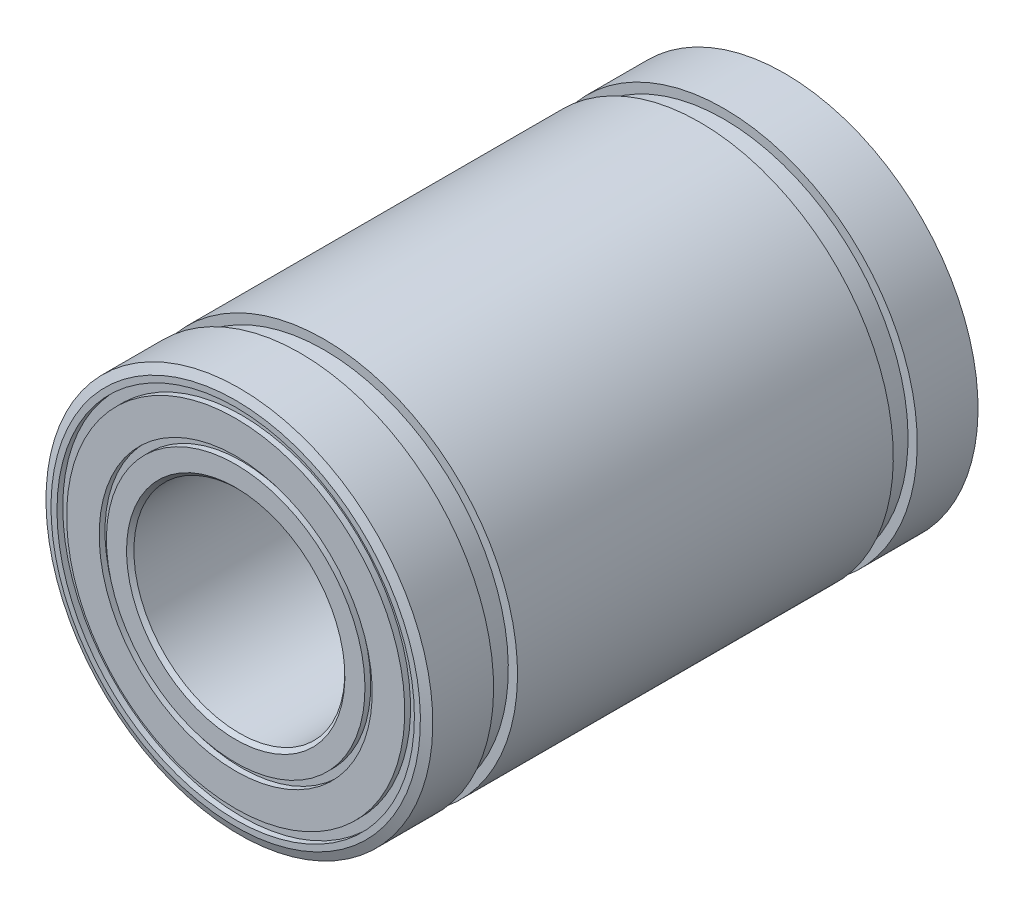
ISO-10303-21;
HEADER;
FILE_DESCRIPTION(('STEP AP214'),'2;1');
FILE_NAME('part.step','',(''),(''),'','','');
FILE_SCHEMA(('AUTOMOTIVE_DESIGN { 1 0 10303 214 1 1 1 1 }'));
ENDSEC;
DATA;
#1=APPLICATION_CONTEXT('core data for automotive mechanical design processes');
#2=APPLICATION_PROTOCOL_DEFINITION('international standard','automotive_design',2000,#1);
#3=PRODUCT_CONTEXT('',#1,'mechanical');
#4=PRODUCT('Part','Part','',(#3));
#5=PRODUCT_RELATED_PRODUCT_CATEGORY('part','',(#4));
#6=PRODUCT_DEFINITION_FORMATION('','',#4);
#7=PRODUCT_DEFINITION_CONTEXT('part definition',#1,'design');
#8=PRODUCT_DEFINITION('design','',#6,#7);
#9=PRODUCT_DEFINITION_SHAPE('','',#8);
#10=(LENGTH_UNIT() NAMED_UNIT(*) SI_UNIT(.MILLI.,.METRE.));
#11=(NAMED_UNIT(*) PLANE_ANGLE_UNIT() SI_UNIT($,.RADIAN.));
#12=(NAMED_UNIT(*) SI_UNIT($,.STERADIAN.) SOLID_ANGLE_UNIT());
#13=UNCERTAINTY_MEASURE_WITH_UNIT(LENGTH_MEASURE(1.E-05),#10,'distance_accuracy_value','');
#14=(GEOMETRIC_REPRESENTATION_CONTEXT(3) GLOBAL_UNCERTAINTY_ASSIGNED_CONTEXT((#13)) GLOBAL_UNIT_ASSIGNED_CONTEXT((#10,
#11,#12)) REPRESENTATION_CONTEXT('',''));
#15=CARTESIAN_POINT('',(0.,0.,0.));
#16=DIRECTION('',(0.,0.,1.));
#17=DIRECTION('',(1.,0.,0.));
#18=AXIS2_PLACEMENT_3D('',#15,#16,#17);
#19=CARTESIAN_POINT('',(7.63714285715196,0.,15.7142857142884));
#20=DIRECTION('',(0.,0.,1.));
#21=DIRECTION('',(0.,-1.,0.));
#22=AXIS2_PLACEMENT_3D('',#19,#20,#21);
#23=PLANE('',#22);
#24=CARTESIAN_POINT('',(0.285714285727279,0.,15.7142857142884));
#25=DIRECTION('',(0.,0.,-1.));
#26=DIRECTION('',(0.,1.,0.));
#27=AXIS2_PLACEMENT_3D('',#24,#25,#26);
#28=CIRCLE('',#27,6.20952380958975);
#29=CARTESIAN_POINT('',(0.285714285727279,6.20952380958975,15.7142857142884));
#30=VERTEX_POINT('',#29);
#31=EDGE_CURVE('E131',#30,#30,#28,.T.);
#32=ORIENTED_EDGE('',*,*,#31,.T.);
#33=EDGE_LOOP('',(#32));
#34=FACE_BOUND('',#33,.T.);
#35=CARTESIAN_POINT('',(0.285714285727279,0.,15.7142857142884));
#36=DIRECTION('',(0.,0.,-1.));
#37=DIRECTION('',(0.,1.,0.));
#38=AXIS2_PLACEMENT_3D('',#35,#36,#37);
#39=CIRCLE('',#38,7.35142857142468);
#40=CARTESIAN_POINT('',(0.285714285727279,7.35142857142468,15.7142857142884));
#41=VERTEX_POINT('',#40);
#42=EDGE_CURVE('E10',#41,#41,#39,.T.);
#43=ORIENTED_EDGE('',*,*,#42,.F.);
#44=EDGE_LOOP('',(#43));
#45=FACE_BOUND('',#44,.T.);
#46=ADVANCED_FACE('F31',(#34,#45),#23,.T.);
#47=CARTESIAN_POINT('',(0.285714285727279,0.,15.7142857142884));
#48=DIRECTION('',(0.,0.,-1.));
#49=DIRECTION('',(0.,1.,0.));
#50=AXIS2_PLACEMENT_3D('',#47,#48,#49);
#51=CYLINDRICAL_SURFACE('',#50,7.35142857142468);
#52=ORIENTED_EDGE('',*,*,#42,.T.);
#53=EDGE_LOOP('',(#52));
#54=FACE_BOUND('',#53,.T.);
#55=CARTESIAN_POINT('',(0.285714285727279,0.,15.3842857142286));
#56=DIRECTION('',(0.,0.,-1.));
#57=DIRECTION('',(0.,1.,0.));
#58=AXIS2_PLACEMENT_3D('',#55,#56,#57);
#59=CIRCLE('',#58,7.35142857142468);
#60=CARTESIAN_POINT('',(0.285714285727279,7.35142857142468,15.3842857142286));
#61=VERTEX_POINT('',#60);
#62=EDGE_CURVE('E37',#61,#61,#59,.T.);
#63=ORIENTED_EDGE('',*,*,#62,.F.);
#64=EDGE_LOOP('',(#63));
#65=FACE_BOUND('',#64,.T.);
#66=ADVANCED_FACE('F149',(#54,#65),#51,.T.);
#67=CARTESIAN_POINT('',(8.04964285715084,0.,15.3842857142286));
#68=DIRECTION('',(0.,0.,1.));
#69=DIRECTION('',(0.,-1.,0.));
#70=AXIS2_PLACEMENT_3D('',#67,#68,#69);
#71=PLANE('',#70);
#72=ORIENTED_EDGE('',*,*,#62,.T.);
#73=EDGE_LOOP('',(#72));
#74=FACE_BOUND('',#73,.T.);
#75=CARTESIAN_POINT('',(0.285714285727279,0.,15.3842857142286));
#76=DIRECTION('',(0.,0.,-1.));
#77=DIRECTION('',(0.,1.,0.));
#78=AXIS2_PLACEMENT_3D('',#75,#76,#77);
#79=CIRCLE('',#78,7.76392857142356);
#80=CARTESIAN_POINT('',(0.285714285727279,7.76392857142355,15.3842857142286));
#81=VERTEX_POINT('',#80);
#82=EDGE_CURVE('E41',#81,#81,#79,.T.);
#83=ORIENTED_EDGE('',*,*,#82,.F.);
#84=EDGE_LOOP('',(#83));
#85=FACE_BOUND('',#84,.T.);
#86=ADVANCED_FACE('F153',(#74,#85),#71,.T.);
#87=CARTESIAN_POINT('',(0.285714285727279,0.,15.7142857142884));
#88=DIRECTION('',(0.,0.,-1.));
#89=DIRECTION('',(0.,1.,0.));
#90=AXIS2_PLACEMENT_3D('',#87,#88,#89);
#91=CYLINDRICAL_SURFACE('',#90,7.76392857142356);
#92=ORIENTED_EDGE('',*,*,#82,.T.);
#93=EDGE_LOOP('',(#92));
#94=FACE_BOUND('',#93,.T.);
#95=CARTESIAN_POINT('',(0.285714285727279,0.,15.7142857142884));
#96=DIRECTION('',(0.,0.,-1.));
#97=DIRECTION('',(0.,1.,0.));
#98=AXIS2_PLACEMENT_3D('',#95,#96,#97);
#99=CIRCLE('',#98,7.76392857142356);
#100=CARTESIAN_POINT('',(0.285714285727279,7.76392857142355,15.7142857142884));
#101=VERTEX_POINT('',#100);
#102=EDGE_CURVE('E45',#101,#101,#99,.T.);
#103=ORIENTED_EDGE('',*,*,#102,.F.);
#104=EDGE_LOOP('',(#103));
#105=FACE_BOUND('',#104,.T.);
#106=ADVANCED_FACE('F157',(#94,#105),#91,.F.);
#107=CARTESIAN_POINT('',(9.90000000000297,0.,15.7142857142884));
#108=DIRECTION('',(0.,0.,1.));
#109=DIRECTION('',(0.,-1.,0.));
#110=AXIS2_PLACEMENT_3D('',#107,#108,#109);
#111=PLANE('',#110);
#112=ORIENTED_EDGE('',*,*,#102,.T.);
#113=EDGE_LOOP('',(#112));
#114=FACE_BOUND('',#113,.T.);
#115=CARTESIAN_POINT('',(0.285714285727279,0.,15.7142857142884));
#116=DIRECTION('',(0.,0.,-1.));
#117=DIRECTION('',(0.,1.,0.));
#118=AXIS2_PLACEMENT_3D('',#115,#116,#117);
#119=CIRCLE('',#118,9.6142857142757);
#120=CARTESIAN_POINT('',(0.285714285727279,9.61428571427569,15.7142857142884));
#121=VERTEX_POINT('',#120);
#122=EDGE_CURVE('E50',#121,#121,#119,.T.);
#123=ORIENTED_EDGE('',*,*,#122,.F.);
#124=EDGE_LOOP('',(#123));
#125=FACE_BOUND('',#124,.T.);
#126=ADVANCED_FACE('F163',(#114,#125),#111,.T.);
#127=CARTESIAN_POINT('',(0.285714285727279,0.,15.7142857142884));
#128=DIRECTION('',(0.,0.,-1.));
#129=DIRECTION('',(0.,1.,0.));
#130=AXIS2_PLACEMENT_3D('',#127,#128,#129);
#131=CYLINDRICAL_SURFACE('',#130,9.6142857142757);
#132=ORIENTED_EDGE('',*,*,#122,.T.);
#133=EDGE_LOOP('',(#132));
#134=FACE_BOUND('',#133,.T.);
#135=CARTESIAN_POINT('',(0.285714285727279,0.,15.3842857142286));
#136=DIRECTION('',(0.,0.,-1.));
#137=DIRECTION('',(0.,1.,0.));
#138=AXIS2_PLACEMENT_3D('',#135,#136,#137);
#139=CIRCLE('',#138,9.6142857142757);
#140=CARTESIAN_POINT('',(0.285714285727279,9.61428571427569,15.3842857142286));
#141=VERTEX_POINT('',#140);
#142=EDGE_CURVE('E53',#141,#141,#139,.T.);
#143=ORIENTED_EDGE('',*,*,#142,.F.);
#144=EDGE_LOOP('',(#143));
#145=FACE_BOUND('',#144,.T.);
#146=ADVANCED_FACE('F167',(#134,#145),#131,.T.);
#147=CARTESIAN_POINT('',(10.4500000000015,0.,15.3842857142286));
#148=DIRECTION('',(0.,0.,1.));
#149=DIRECTION('',(0.,-1.,0.));
#150=AXIS2_PLACEMENT_3D('',#147,#148,#149);
#151=PLANE('',#150);
#152=ORIENTED_EDGE('',*,*,#142,.T.);
#153=EDGE_LOOP('',(#152));
#154=FACE_BOUND('',#153,.T.);
#155=CARTESIAN_POINT('',(0.285714285727279,0.,15.3842857142286));
#156=DIRECTION('',(0.,0.,-1.));
#157=DIRECTION('',(0.,1.,0.));
#158=AXIS2_PLACEMENT_3D('',#155,#156,#157);
#159=CIRCLE('',#158,10.1642857142742);
#160=CARTESIAN_POINT('',(0.285714285727279,10.1642857142742,15.3842857142286));
#161=VERTEX_POINT('',#160);
#162=EDGE_CURVE('E56',#161,#161,#159,.T.);
#163=ORIENTED_EDGE('',*,*,#162,.F.);
#164=EDGE_LOOP('',(#163));
#165=FACE_BOUND('',#164,.T.);
#166=ADVANCED_FACE('F171',(#154,#165),#151,.T.);
#167=CARTESIAN_POINT('',(0.285714285727279,0.,15.7142857142884));
#168=DIRECTION('',(0.,0.,-1.));
#169=DIRECTION('',(0.,1.,0.));
#170=AXIS2_PLACEMENT_3D('',#167,#168,#169);
#171=CYLINDRICAL_SURFACE('',#170,10.1642857142742);
#172=ORIENTED_EDGE('',*,*,#162,.T.);
#173=EDGE_LOOP('',(#172));
#174=FACE_BOUND('',#173,.T.);
#175=CARTESIAN_POINT('',(0.285714285727279,0.,15.7142857142884));
#176=DIRECTION('',(0.,0.,-1.));
#177=DIRECTION('',(0.,1.,0.));
#178=AXIS2_PLACEMENT_3D('',#175,#176,#177);
#179=CIRCLE('',#178,10.1642857142742);
#180=CARTESIAN_POINT('',(0.285714285727279,10.1642857142742,15.7142857142884));
#181=VERTEX_POINT('',#180);
#182=EDGE_CURVE('E59',#181,#181,#179,.T.);
#183=ORIENTED_EDGE('',*,*,#182,.F.);
#184=EDGE_LOOP('',(#183));
#185=FACE_BOUND('',#184,.T.);
#186=ADVANCED_FACE('F175',(#174,#185),#171,.F.);
#187=CARTESIAN_POINT('',(10.790476190447,0.,15.7142857142884));
#188=DIRECTION('',(0.,0.,1.));
#189=DIRECTION('',(0.,-1.,0.));
#190=AXIS2_PLACEMENT_3D('',#187,#188,#189);
#191=PLANE('',#190);
#192=ORIENTED_EDGE('',*,*,#182,.T.);
#193=EDGE_LOOP('',(#192));
#194=FACE_BOUND('',#193,.T.);
#195=CARTESIAN_POINT('',(0.285714285727279,0.,15.7142857142884));
#196=DIRECTION('',(0.,0.,-1.));
#197=DIRECTION('',(0.,1.,0.));
#198=AXIS2_PLACEMENT_3D('',#195,#196,#197);
#199=CIRCLE('',#198,10.5047619047197);
#200=CARTESIAN_POINT('',(0.285714285727279,10.5047619047197,15.7142857142884));
#201=VERTEX_POINT('',#200);
#202=EDGE_CURVE('E62',#201,#201,#199,.T.);
#203=ORIENTED_EDGE('',*,*,#202,.F.);
#204=EDGE_LOOP('',(#203));
#205=FACE_BOUND('',#204,.T.);
#206=ADVANCED_FACE('F179',(#194,#205),#191,.T.);
#207=CARTESIAN_POINT('',(0.285714285727279,0.,15.5047619047045));
#208=DIRECTION('',(0.,0.,-1.));
#209=DIRECTION('',(0.,1.,0.));
#210=AXIS2_PLACEMENT_3D('',#207,#208,#209);
#211=CONICAL_SURFACE('',#210,11.,1.17055566968845);
#212=ORIENTED_EDGE('',*,*,#202,.T.);
#213=EDGE_LOOP('',(#212));
#214=FACE_BOUND('',#213,.T.);
#215=CARTESIAN_POINT('',(0.285714285727279,0.,15.5047619047045));
#216=DIRECTION('',(0.,0.,-1.));
#217=DIRECTION('',(0.,1.,0.));
#218=AXIS2_PLACEMENT_3D('',#215,#216,#217);
#219=CIRCLE('',#218,11.);
#220=CARTESIAN_POINT('',(0.285714285727279,11.,15.5047619047045));
#221=VERTEX_POINT('',#220);
#222=EDGE_CURVE('E65',#221,#221,#219,.T.);
#223=ORIENTED_EDGE('',*,*,#222,.F.);
#224=EDGE_LOOP('',(#223));
#225=FACE_BOUND('',#224,.T.);
#226=ADVANCED_FACE('F183',(#214,#225),#211,.T.);
#227=CARTESIAN_POINT('',(0.285714285727279,0.,15.7142857142884));
#228=DIRECTION('',(0.,0.,-1.));
#229=DIRECTION('',(0.,1.,0.));
#230=AXIS2_PLACEMENT_3D('',#227,#228,#229);
#231=CYLINDRICAL_SURFACE('',#230,11.);
#232=ORIENTED_EDGE('',*,*,#222,.T.);
#233=EDGE_LOOP('',(#232));
#234=FACE_BOUND('',#233,.T.);
#235=CARTESIAN_POINT('',(0.285714285727279,0.,12.047619047571));
#236=DIRECTION('',(0.,0.,-1.));
#237=DIRECTION('',(0.,1.,0.));
#238=AXIS2_PLACEMENT_3D('',#235,#236,#237);
#239=CIRCLE('',#238,11.);
#240=CARTESIAN_POINT('',(0.285714285727279,11.,12.047619047571));
#241=VERTEX_POINT('',#240);
#242=EDGE_CURVE('E68',#241,#241,#239,.T.);
#243=ORIENTED_EDGE('',*,*,#242,.F.);
#244=EDGE_LOOP('',(#243));
#245=FACE_BOUND('',#244,.T.);
#246=ADVANCED_FACE('F187',(#234,#245),#231,.T.);
#247=CARTESIAN_POINT('',(10.7619047619192,0.,12.047619047571));
#248=DIRECTION('',(0.,0.,-1.));
#249=DIRECTION('',(0.,1.,0.));
#250=AXIS2_PLACEMENT_3D('',#247,#248,#249);
#251=PLANE('',#250);
#252=ORIENTED_EDGE('',*,*,#242,.T.);
#253=EDGE_LOOP('',(#252));
#254=FACE_BOUND('',#253,.T.);
#255=CARTESIAN_POINT('',(0.285714285727279,0.,12.047619047571));
#256=DIRECTION('',(0.,0.,-1.));
#257=DIRECTION('',(0.,1.,0.));
#258=AXIS2_PLACEMENT_3D('',#255,#256,#257);
#259=CIRCLE('',#258,10.4761904761919);
#260=CARTESIAN_POINT('',(0.285714285727279,10.4761904761919,12.047619047571));
#261=VERTEX_POINT('',#260);
#262=EDGE_CURVE('E71',#261,#261,#259,.T.);
#263=ORIENTED_EDGE('',*,*,#262,.F.);
#264=EDGE_LOOP('',(#263));
#265=FACE_BOUND('',#264,.T.);
#266=ADVANCED_FACE('F191',(#254,#265),#251,.T.);
#267=CARTESIAN_POINT('',(0.285714285727279,0.,15.7142857142884));
#268=DIRECTION('',(0.,0.,-1.));
#269=DIRECTION('',(0.,1.,0.));
#270=AXIS2_PLACEMENT_3D('',#267,#268,#269);
#271=CYLINDRICAL_SURFACE('',#270,10.4761904761919);
#272=ORIENTED_EDGE('',*,*,#262,.T.);
#273=EDGE_LOOP('',(#272));
#274=FACE_BOUND('',#273,.T.);
#275=CARTESIAN_POINT('',(0.28571428572728,0.,10.6857142856699));
#276=DIRECTION('',(0.,0.,-1.));
#277=DIRECTION('',(0.,1.,0.));
#278=AXIS2_PLACEMENT_3D('',#275,#276,#277);
#279=CIRCLE('',#278,10.4761904761919);
#280=CARTESIAN_POINT('',(0.28571428572728,10.4761904761919,10.6857142856699));
#281=VERTEX_POINT('',#280);
#282=EDGE_CURVE('E74',#281,#281,#279,.T.);
#283=ORIENTED_EDGE('',*,*,#282,.F.);
#284=EDGE_LOOP('',(#283));
#285=FACE_BOUND('',#284,.T.);
#286=ADVANCED_FACE('F195',(#274,#285),#271,.T.);
#287=CARTESIAN_POINT('',(11.2857142857273,0.,10.6857142856699));
#288=DIRECTION('',(0.,0.,1.));
#289=DIRECTION('',(0.,-1.,0.));
#290=AXIS2_PLACEMENT_3D('',#287,#288,#289);
#291=PLANE('',#290);
#292=ORIENTED_EDGE('',*,*,#282,.T.);
#293=EDGE_LOOP('',(#292));
#294=FACE_BOUND('',#293,.T.);
#295=CARTESIAN_POINT('',(0.28571428572728,0.,10.6857142856699));
#296=DIRECTION('',(0.,0.,-1.));
#297=DIRECTION('',(0.,1.,0.));
#298=AXIS2_PLACEMENT_3D('',#295,#296,#297);
#299=CIRCLE('',#298,11.);
#300=CARTESIAN_POINT('',(0.28571428572728,11.,10.6857142856699));
#301=VERTEX_POINT('',#300);
#302=EDGE_CURVE('E77',#301,#301,#299,.T.);
#303=ORIENTED_EDGE('',*,*,#302,.F.);
#304=EDGE_LOOP('',(#303));
#305=FACE_BOUND('',#304,.T.);
#306=ADVANCED_FACE('F199',(#294,#305),#291,.T.);
#307=CARTESIAN_POINT('',(0.285714285727279,0.,15.7142857142884));
#308=DIRECTION('',(0.,0.,-1.));
#309=DIRECTION('',(0.,1.,0.));
#310=AXIS2_PLACEMENT_3D('',#307,#308,#309);
#311=CYLINDRICAL_SURFACE('',#310,11.);
#312=ORIENTED_EDGE('',*,*,#302,.T.);
#313=EDGE_LOOP('',(#312));
#314=FACE_BOUND('',#313,.T.);
#315=CARTESIAN_POINT('',(0.285714285727282,0.,-10.6857142857008));
#316=DIRECTION('',(0.,0.,-1.));
#317=DIRECTION('',(0.,1.,0.));
#318=AXIS2_PLACEMENT_3D('',#315,#316,#317);
#319=CIRCLE('',#318,11.);
#320=CARTESIAN_POINT('',(0.285714285727282,11.,-10.6857142857008));
#321=VERTEX_POINT('',#320);
#322=EDGE_CURVE('E80',#321,#321,#319,.T.);
#323=ORIENTED_EDGE('',*,*,#322,.F.);
#324=EDGE_LOOP('',(#323));
#325=FACE_BOUND('',#324,.T.);
#326=ADVANCED_FACE('F203',(#314,#325),#311,.T.);
#327=CARTESIAN_POINT('',(10.7619047619192,0.,-10.6857142857008));
#328=DIRECTION('',(0.,0.,-1.));
#329=DIRECTION('',(0.,1.,0.));
#330=AXIS2_PLACEMENT_3D('',#327,#328,#329);
#331=PLANE('',#330);
#332=ORIENTED_EDGE('',*,*,#322,.T.);
#333=EDGE_LOOP('',(#332));
#334=FACE_BOUND('',#333,.T.);
#335=CARTESIAN_POINT('',(0.285714285727282,0.,-10.6857142857008));
#336=DIRECTION('',(0.,0.,-1.));
#337=DIRECTION('',(0.,1.,0.));
#338=AXIS2_PLACEMENT_3D('',#335,#336,#337);
#339=CIRCLE('',#338,10.4761904761919);
#340=CARTESIAN_POINT('',(0.285714285727282,10.4761904761919,-10.6857142857008));
#341=VERTEX_POINT('',#340);
#342=EDGE_CURVE('E83',#341,#341,#339,.T.);
#343=ORIENTED_EDGE('',*,*,#342,.F.);
#344=EDGE_LOOP('',(#343));
#345=FACE_BOUND('',#344,.T.);
#346=ADVANCED_FACE('F207',(#334,#345),#331,.T.);
#347=CARTESIAN_POINT('',(0.285714285727279,0.,15.7142857142884));
#348=DIRECTION('',(0.,0.,-1.));
#349=DIRECTION('',(0.,1.,0.));
#350=AXIS2_PLACEMENT_3D('',#347,#348,#349);
#351=CYLINDRICAL_SURFACE('',#350,10.4761904761919);
#352=ORIENTED_EDGE('',*,*,#342,.T.);
#353=EDGE_LOOP('',(#352));
#354=FACE_BOUND('',#353,.T.);
#355=CARTESIAN_POINT('',(0.285714285727282,0.,-12.0476190476019));
#356=DIRECTION('',(0.,0.,-1.));
#357=DIRECTION('',(0.,1.,0.));
#358=AXIS2_PLACEMENT_3D('',#355,#356,#357);
#359=CIRCLE('',#358,10.4761904761919);
#360=CARTESIAN_POINT('',(0.285714285727282,10.4761904761919,-12.0476190476019));
#361=VERTEX_POINT('',#360);
#362=EDGE_CURVE('E86',#361,#361,#359,.T.);
#363=ORIENTED_EDGE('',*,*,#362,.F.);
#364=EDGE_LOOP('',(#363));
#365=FACE_BOUND('',#364,.T.);
#366=ADVANCED_FACE('F211',(#354,#365),#351,.T.);
#367=CARTESIAN_POINT('',(11.2857142857273,0.,-12.0476190476019));
#368=DIRECTION('',(0.,0.,1.));
#369=DIRECTION('',(0.,-1.,0.));
#370=AXIS2_PLACEMENT_3D('',#367,#368,#369);
#371=PLANE('',#370);
#372=ORIENTED_EDGE('',*,*,#362,.T.);
#373=EDGE_LOOP('',(#372));
#374=FACE_BOUND('',#373,.T.);
#375=CARTESIAN_POINT('',(0.285714285727282,0.,-12.0476190476019));
#376=DIRECTION('',(0.,0.,-1.));
#377=DIRECTION('',(0.,1.,0.));
#378=AXIS2_PLACEMENT_3D('',#375,#376,#377);
#379=CIRCLE('',#378,11.);
#380=CARTESIAN_POINT('',(0.285714285727282,11.,-12.0476190476019));
#381=VERTEX_POINT('',#380);
#382=EDGE_CURVE('E89',#381,#381,#379,.T.);
#383=ORIENTED_EDGE('',*,*,#382,.F.);
#384=EDGE_LOOP('',(#383));
#385=FACE_BOUND('',#384,.T.);
#386=ADVANCED_FACE('F215',(#374,#385),#371,.T.);
#387=CARTESIAN_POINT('',(0.285714285727279,0.,15.7142857142884));
#388=DIRECTION('',(0.,0.,-1.));
#389=DIRECTION('',(0.,1.,0.));
#390=AXIS2_PLACEMENT_3D('',#387,#388,#389);
#391=CYLINDRICAL_SURFACE('',#390,11.);
#392=ORIENTED_EDGE('',*,*,#382,.T.);
#393=EDGE_LOOP('',(#392));
#394=FACE_BOUND('',#393,.T.);
#395=CARTESIAN_POINT('',(0.285714285727283,0.,-15.5047619047354));
#396=DIRECTION('',(0.,0.,-1.));
#397=DIRECTION('',(0.,1.,0.));
#398=AXIS2_PLACEMENT_3D('',#395,#396,#397);
#399=CIRCLE('',#398,11.);
#400=CARTESIAN_POINT('',(0.285714285727283,11.,-15.5047619047354));
#401=VERTEX_POINT('',#400);
#402=EDGE_CURVE('E92',#401,#401,#399,.T.);
#403=ORIENTED_EDGE('',*,*,#402,.F.);
#404=EDGE_LOOP('',(#403));
#405=FACE_BOUND('',#404,.T.);
#406=ADVANCED_FACE('F219',(#394,#405),#391,.T.);
#407=CARTESIAN_POINT('',(0.285714285727283,0.,-15.7142857142587));
#408=DIRECTION('',(0.,0.,1.));
#409=DIRECTION('',(0.,-1.,0.));
#410=AXIS2_PLACEMENT_3D('',#407,#408,#409);
#411=CONICAL_SURFACE('',#410,10.5047619047495,1.17055566977088);
#412=ORIENTED_EDGE('',*,*,#402,.T.);
#413=EDGE_LOOP('',(#412));
#414=FACE_BOUND('',#413,.T.);
#415=CARTESIAN_POINT('',(0.285714285727283,0.,-15.7142857142587));
#416=DIRECTION('',(0.,0.,-1.));
#417=DIRECTION('',(0.,1.,0.));
#418=AXIS2_PLACEMENT_3D('',#415,#416,#417);
#419=CIRCLE('',#418,10.5047619047495);
#420=CARTESIAN_POINT('',(0.285714285727283,10.5047619047495,-15.7142857142587));
#421=VERTEX_POINT('',#420);
#422=EDGE_CURVE('E95',#421,#421,#419,.T.);
#423=ORIENTED_EDGE('',*,*,#422,.F.);
#424=EDGE_LOOP('',(#423));
#425=FACE_BOUND('',#424,.T.);
#426=ADVANCED_FACE('F223',(#414,#425),#411,.T.);
#427=CARTESIAN_POINT('',(10.4500000000015,0.,-15.7142857142587));
#428=DIRECTION('',(0.,0.,-1.));
#429=DIRECTION('',(0.,1.,0.));
#430=AXIS2_PLACEMENT_3D('',#427,#428,#429);
#431=PLANE('',#430);
#432=ORIENTED_EDGE('',*,*,#422,.T.);
#433=EDGE_LOOP('',(#432));
#434=FACE_BOUND('',#433,.T.);
#435=CARTESIAN_POINT('',(0.285714285727283,0.,-15.7142857142587));
#436=DIRECTION('',(0.,0.,-1.));
#437=DIRECTION('',(0.,1.,0.));
#438=AXIS2_PLACEMENT_3D('',#435,#436,#437);
#439=CIRCLE('',#438,10.1642857142742);
#440=CARTESIAN_POINT('',(0.285714285727283,10.1642857142742,-15.7142857142587));
#441=VERTEX_POINT('',#440);
#442=EDGE_CURVE('E98',#441,#441,#439,.T.);
#443=ORIENTED_EDGE('',*,*,#442,.F.);
#444=EDGE_LOOP('',(#443));
#445=FACE_BOUND('',#444,.T.);
#446=ADVANCED_FACE('F227',(#434,#445),#431,.T.);
#447=CARTESIAN_POINT('',(0.285714285727279,0.,15.7142857142884));
#448=DIRECTION('',(0.,0.,-1.));
#449=DIRECTION('',(0.,1.,0.));
#450=AXIS2_PLACEMENT_3D('',#447,#448,#449);
#451=CYLINDRICAL_SURFACE('',#450,10.1642857142742);
#452=ORIENTED_EDGE('',*,*,#442,.T.);
#453=EDGE_LOOP('',(#452));
#454=FACE_BOUND('',#453,.T.);
#455=CARTESIAN_POINT('',(0.285714285727283,0.,-15.3842857142595));
#456=DIRECTION('',(0.,0.,-1.));
#457=DIRECTION('',(0.,1.,0.));
#458=AXIS2_PLACEMENT_3D('',#455,#456,#457);
#459=CIRCLE('',#458,10.1642857142742);
#460=CARTESIAN_POINT('',(0.285714285727283,10.1642857142742,-15.3842857142595));
#461=VERTEX_POINT('',#460);
#462=EDGE_CURVE('E101',#461,#461,#459,.T.);
#463=ORIENTED_EDGE('',*,*,#462,.F.);
#464=EDGE_LOOP('',(#463));
#465=FACE_BOUND('',#464,.T.);
#466=ADVANCED_FACE('F231',(#454,#465),#451,.F.);
#467=CARTESIAN_POINT('',(9.90000000000297,0.,-15.3842857142595));
#468=DIRECTION('',(0.,0.,-1.));
#469=DIRECTION('',(0.,1.,0.));
#470=AXIS2_PLACEMENT_3D('',#467,#468,#469);
#471=PLANE('',#470);
#472=ORIENTED_EDGE('',*,*,#462,.T.);
#473=EDGE_LOOP('',(#472));
#474=FACE_BOUND('',#473,.T.);
#475=CARTESIAN_POINT('',(0.285714285727283,0.,-15.3842857142595));
#476=DIRECTION('',(0.,0.,-1.));
#477=DIRECTION('',(0.,1.,0.));
#478=AXIS2_PLACEMENT_3D('',#475,#476,#477);
#479=CIRCLE('',#478,9.61428571427569);
#480=CARTESIAN_POINT('',(0.285714285727283,9.6142857142757,-15.3842857142595));
#481=VERTEX_POINT('',#480);
#482=EDGE_CURVE('E104',#481,#481,#479,.T.);
#483=ORIENTED_EDGE('',*,*,#482,.F.);
#484=EDGE_LOOP('',(#483));
#485=FACE_BOUND('',#484,.T.);
#486=ADVANCED_FACE('F235',(#474,#485),#471,.T.);
#487=CARTESIAN_POINT('',(0.285714285727279,0.,15.7142857142884));
#488=DIRECTION('',(0.,0.,-1.));
#489=DIRECTION('',(0.,1.,0.));
#490=AXIS2_PLACEMENT_3D('',#487,#488,#489);
#491=CYLINDRICAL_SURFACE('',#490,9.61428571427569);
#492=ORIENTED_EDGE('',*,*,#482,.T.);
#493=EDGE_LOOP('',(#492));
#494=FACE_BOUND('',#493,.T.);
#495=CARTESIAN_POINT('',(0.285714285727283,0.,-15.7142857142587));
#496=DIRECTION('',(0.,0.,-1.));
#497=DIRECTION('',(0.,1.,0.));
#498=AXIS2_PLACEMENT_3D('',#495,#496,#497);
#499=CIRCLE('',#498,9.61428571427569);
#500=CARTESIAN_POINT('',(0.285714285727283,9.6142857142757,-15.7142857142587));
#501=VERTEX_POINT('',#500);
#502=EDGE_CURVE('E107',#501,#501,#499,.T.);
#503=ORIENTED_EDGE('',*,*,#502,.F.);
#504=EDGE_LOOP('',(#503));
#505=FACE_BOUND('',#504,.T.);
#506=ADVANCED_FACE('F239',(#494,#505),#491,.T.);
#507=CARTESIAN_POINT('',(8.04964285715084,0.,-15.7142857142587));
#508=DIRECTION('',(0.,0.,-1.));
#509=DIRECTION('',(0.,1.,0.));
#510=AXIS2_PLACEMENT_3D('',#507,#508,#509);
#511=PLANE('',#510);
#512=ORIENTED_EDGE('',*,*,#502,.T.);
#513=EDGE_LOOP('',(#512));
#514=FACE_BOUND('',#513,.T.);
#515=CARTESIAN_POINT('',(0.285714285727283,0.,-15.7142857142587));
#516=DIRECTION('',(0.,0.,-1.));
#517=DIRECTION('',(0.,1.,0.));
#518=AXIS2_PLACEMENT_3D('',#515,#516,#517);
#519=CIRCLE('',#518,7.76392857142356);
#520=CARTESIAN_POINT('',(0.285714285727283,7.76392857142356,-15.7142857142587));
#521=VERTEX_POINT('',#520);
#522=EDGE_CURVE('E110',#521,#521,#519,.T.);
#523=ORIENTED_EDGE('',*,*,#522,.F.);
#524=EDGE_LOOP('',(#523));
#525=FACE_BOUND('',#524,.T.);
#526=ADVANCED_FACE('F243',(#514,#525),#511,.T.);
#527=CARTESIAN_POINT('',(0.285714285727279,0.,15.7142857142884));
#528=DIRECTION('',(0.,0.,-1.));
#529=DIRECTION('',(0.,1.,0.));
#530=AXIS2_PLACEMENT_3D('',#527,#528,#529);
#531=CYLINDRICAL_SURFACE('',#530,7.76392857142356);
#532=ORIENTED_EDGE('',*,*,#522,.T.);
#533=EDGE_LOOP('',(#532));
#534=FACE_BOUND('',#533,.T.);
#535=CARTESIAN_POINT('',(0.285714285727283,0.,-15.3842857142595));
#536=DIRECTION('',(0.,0.,-1.));
#537=DIRECTION('',(0.,1.,0.));
#538=AXIS2_PLACEMENT_3D('',#535,#536,#537);
#539=CIRCLE('',#538,7.76392857142356);
#540=CARTESIAN_POINT('',(0.285714285727283,7.76392857142356,-15.3842857142595));
#541=VERTEX_POINT('',#540);
#542=EDGE_CURVE('E113',#541,#541,#539,.T.);
#543=ORIENTED_EDGE('',*,*,#542,.F.);
#544=EDGE_LOOP('',(#543));
#545=FACE_BOUND('',#544,.T.);
#546=ADVANCED_FACE('F247',(#534,#545),#531,.F.);
#547=CARTESIAN_POINT('',(7.63714285715196,0.,-15.3842857142595));
#548=DIRECTION('',(0.,0.,-1.));
#549=DIRECTION('',(0.,1.,0.));
#550=AXIS2_PLACEMENT_3D('',#547,#548,#549);
#551=PLANE('',#550);
#552=ORIENTED_EDGE('',*,*,#542,.T.);
#553=EDGE_LOOP('',(#552));
#554=FACE_BOUND('',#553,.T.);
#555=CARTESIAN_POINT('',(0.285714285727283,0.,-15.3842857142595));
#556=DIRECTION('',(0.,0.,-1.));
#557=DIRECTION('',(0.,1.,0.));
#558=AXIS2_PLACEMENT_3D('',#555,#556,#557);
#559=CIRCLE('',#558,7.35142857142467);
#560=CARTESIAN_POINT('',(0.285714285727283,7.35142857142468,-15.3842857142595));
#561=VERTEX_POINT('',#560);
#562=EDGE_CURVE('E116',#561,#561,#559,.T.);
#563=ORIENTED_EDGE('',*,*,#562,.F.);
#564=EDGE_LOOP('',(#563));
#565=FACE_BOUND('',#564,.T.);
#566=ADVANCED_FACE('F251',(#554,#565),#551,.T.);
#567=CARTESIAN_POINT('',(0.285714285727279,0.,15.7142857142884));
#568=DIRECTION('',(0.,0.,-1.));
#569=DIRECTION('',(0.,1.,0.));
#570=AXIS2_PLACEMENT_3D('',#567,#568,#569);
#571=CYLINDRICAL_SURFACE('',#570,7.35142857142467);
#572=ORIENTED_EDGE('',*,*,#562,.T.);
#573=EDGE_LOOP('',(#572));
#574=FACE_BOUND('',#573,.T.);
#575=CARTESIAN_POINT('',(0.285714285727283,0.,-15.7142857142587));
#576=DIRECTION('',(0.,0.,-1.));
#577=DIRECTION('',(0.,1.,0.));
#578=AXIS2_PLACEMENT_3D('',#575,#576,#577);
#579=CIRCLE('',#578,7.35142857142467);
#580=CARTESIAN_POINT('',(0.285714285727283,7.35142857142468,-15.7142857142587));
#581=VERTEX_POINT('',#580);
#582=EDGE_CURVE('E119',#581,#581,#579,.T.);
#583=ORIENTED_EDGE('',*,*,#582,.F.);
#584=EDGE_LOOP('',(#583));
#585=FACE_BOUND('',#584,.T.);
#586=ADVANCED_FACE('F255',(#574,#585),#571,.T.);
#587=CARTESIAN_POINT('',(6.4952380952277,0.,-15.7142857142587));
#588=DIRECTION('',(0.,0.,-1.));
#589=DIRECTION('',(0.,1.,0.));
#590=AXIS2_PLACEMENT_3D('',#587,#588,#589);
#591=PLANE('',#590);
#592=ORIENTED_EDGE('',*,*,#582,.T.);
#593=EDGE_LOOP('',(#592));
#594=FACE_BOUND('',#593,.T.);
#595=CARTESIAN_POINT('',(0.285714285727283,0.,-15.7142857142587));
#596=DIRECTION('',(0.,0.,-1.));
#597=DIRECTION('',(0.,1.,0.));
#598=AXIS2_PLACEMENT_3D('',#595,#596,#597);
#599=CIRCLE('',#598,6.20952380950042);
#600=CARTESIAN_POINT('',(0.285714285727283,6.20952380950042,-15.7142857142587));
#601=VERTEX_POINT('',#600);
#602=EDGE_CURVE('E122',#601,#601,#599,.T.);
#603=ORIENTED_EDGE('',*,*,#602,.F.);
#604=EDGE_LOOP('',(#603));
#605=FACE_BOUND('',#604,.T.);
#606=ADVANCED_FACE('F259',(#594,#605),#591,.T.);
#607=CARTESIAN_POINT('',(0.285714285727283,0.,-15.5047619047582));
#608=DIRECTION('',(0.,0.,-1.));
#609=DIRECTION('',(0.,1.,0.));
#610=AXIS2_PLACEMENT_3D('',#607,#608,#609);
#611=CONICAL_SURFACE('',#610,6.,0.78539816339744);
#612=ORIENTED_EDGE('',*,*,#602,.T.);
#613=EDGE_LOOP('',(#612));
#614=FACE_BOUND('',#613,.T.);
#615=CARTESIAN_POINT('',(0.285714285727283,0.,-15.5047619047582));
#616=DIRECTION('',(0.,0.,-1.));
#617=DIRECTION('',(0.,1.,0.));
#618=AXIS2_PLACEMENT_3D('',#615,#616,#617);
#619=CIRCLE('',#618,6.);
#620=CARTESIAN_POINT('',(0.285714285727283,6.,-15.5047619047582));
#621=VERTEX_POINT('',#620);
#622=EDGE_CURVE('E125',#621,#621,#619,.T.);
#623=ORIENTED_EDGE('',*,*,#622,.F.);
#624=EDGE_LOOP('',(#623));
#625=FACE_BOUND('',#624,.T.);
#626=ADVANCED_FACE('F145',(#614,#625),#611,.F.);
#627=CARTESIAN_POINT('',(0.285714285727279,0.,15.7142857142884));
#628=DIRECTION('',(0.,0.,-1.));
#629=DIRECTION('',(0.,1.,0.));
#630=AXIS2_PLACEMENT_3D('',#627,#628,#629);
#631=CYLINDRICAL_SURFACE('',#630,6.);
#632=ORIENTED_EDGE('',*,*,#622,.T.);
#633=EDGE_LOOP('',(#632));
#634=FACE_BOUND('',#633,.T.);
#635=CARTESIAN_POINT('',(0.285714285727279,0.,15.5047619046987));
#636=DIRECTION('',(0.,0.,-1.));
#637=DIRECTION('',(0.,1.,0.));
#638=AXIS2_PLACEMENT_3D('',#635,#636,#637);
#639=CIRCLE('',#638,6.);
#640=CARTESIAN_POINT('',(0.285714285727279,6.,15.5047619046987));
#641=VERTEX_POINT('',#640);
#642=EDGE_CURVE('E128',#641,#641,#639,.T.);
#643=ORIENTED_EDGE('',*,*,#642,.F.);
#644=EDGE_LOOP('',(#643));
#645=FACE_BOUND('',#644,.T.);
#646=ADVANCED_FACE('F139',(#634,#645),#631,.F.);
#647=CARTESIAN_POINT('',(0.285714285727279,0.,15.7142857142884));
#648=DIRECTION('',(0.,0.,1.));
#649=DIRECTION('',(0.,-1.,0.));
#650=AXIS2_PLACEMENT_3D('',#647,#648,#649);
#651=CONICAL_SURFACE('',#650,6.20952380958975,0.785398163397448);
#652=ORIENTED_EDGE('',*,*,#642,.T.);
#653=EDGE_LOOP('',(#652));
#654=FACE_BOUND('',#653,.T.);
#655=ORIENTED_EDGE('',*,*,#31,.F.);
#656=EDGE_LOOP('',(#655));
#657=FACE_BOUND('',#656,.T.);
#658=ADVANCED_FACE('F137',(#654,#657),#651,.F.);
#659=CLOSED_SHELL('',(#46,#66,#86,#106,#126,#146,#166,#186,#206,#226,#246,#266,#286,#306,#326,
#346,#366,#386,#406,#426,#446,#466,#486,#506,#526,#546,#566,#586,#606,#626,#646,#658));
#660=MANIFOLD_SOLID_BREP('B2',#659);
#661=ADVANCED_BREP_SHAPE_REPRESENTATION('',(#18,#660),#14);
#662=SHAPE_DEFINITION_REPRESENTATION(#9,#661);
ENDSEC;
END-ISO-10303-21;
